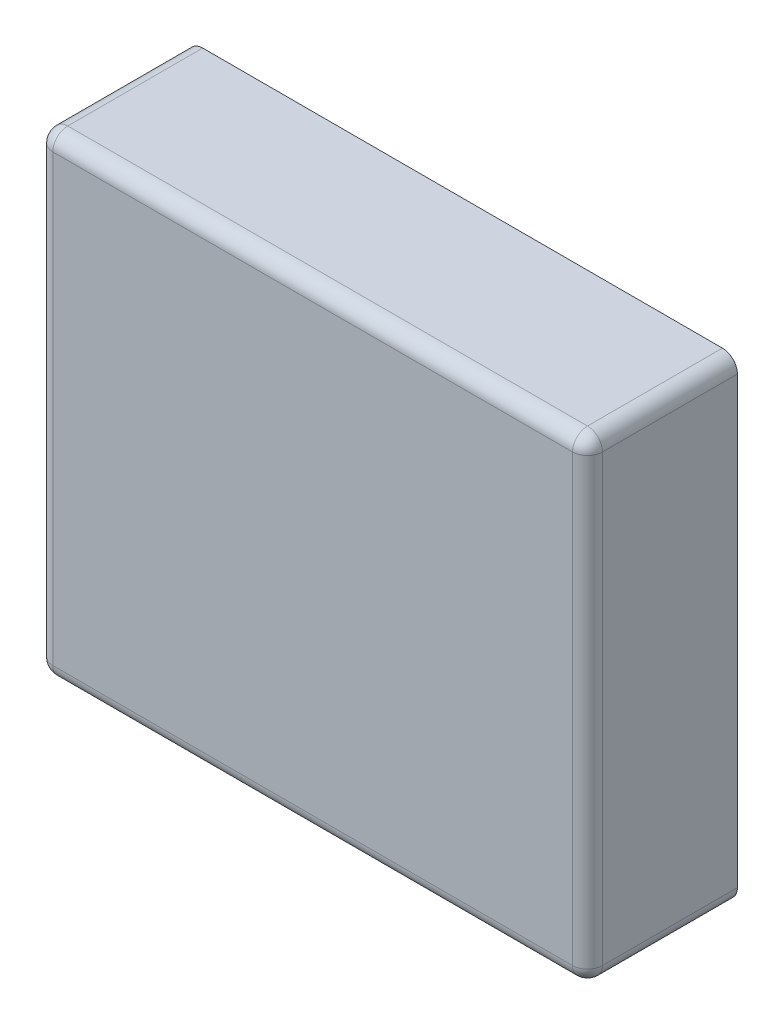
ISO-10303-21;
HEADER;
FILE_DESCRIPTION(('STEP AP214'),'2;1');
FILE_NAME('part.step','',(''),(''),'','','');
FILE_SCHEMA(('AUTOMOTIVE_DESIGN { 1 0 10303 214 1 1 1 1 }'));
ENDSEC;
DATA;
#1=APPLICATION_CONTEXT('core data for automotive mechanical design processes');
#2=APPLICATION_PROTOCOL_DEFINITION('international standard','automotive_design',2000,#1);
#3=PRODUCT_CONTEXT('',#1,'mechanical');
#4=PRODUCT('Part','Part','',(#3));
#5=PRODUCT_RELATED_PRODUCT_CATEGORY('part','',(#4));
#6=PRODUCT_DEFINITION_FORMATION('','',#4);
#7=PRODUCT_DEFINITION_CONTEXT('part definition',#1,'design');
#8=PRODUCT_DEFINITION('design','',#6,#7);
#9=PRODUCT_DEFINITION_SHAPE('','',#8);
#10=(LENGTH_UNIT() NAMED_UNIT(*) SI_UNIT(.MILLI.,.METRE.));
#11=(NAMED_UNIT(*) PLANE_ANGLE_UNIT() SI_UNIT($,.RADIAN.));
#12=(NAMED_UNIT(*) SI_UNIT($,.STERADIAN.) SOLID_ANGLE_UNIT());
#13=UNCERTAINTY_MEASURE_WITH_UNIT(LENGTH_MEASURE(1.E-05),#10,'distance_accuracy_value','');
#14=(GEOMETRIC_REPRESENTATION_CONTEXT(3) GLOBAL_UNCERTAINTY_ASSIGNED_CONTEXT((#13)) GLOBAL_UNIT_ASSIGNED_CONTEXT((#10,
#11,#12)) REPRESENTATION_CONTEXT('',''));
#15=CARTESIAN_POINT('',(0.,0.,0.));
#16=DIRECTION('',(0.,0.,1.));
#17=DIRECTION('',(1.,0.,0.));
#18=AXIS2_PLACEMENT_3D('',#15,#16,#17);
#19=CARTESIAN_POINT('',(0.,0.,0.));
#20=DIRECTION('',(0.,0.,1.));
#21=DIRECTION('',(1.,0.,0.));
#22=AXIS2_PLACEMENT_3D('',#19,#20,#21);
#23=PLANE('',#22);
#24=DIRECTION('',(1.,0.,0.));
#25=VECTOR('',#24,1.);
#26=CARTESIAN_POINT('',(-54.9941107184923,-64.4935217903416,0.));
#27=LINE('',#26,#25);
#28=CARTESIAN_POINT('',(-51.9941107184923,-64.4935217903416,0.));
#29=VERTEX_POINT('',#28);
#30=CARTESIAN_POINT('',(52.0058892815077,-64.4935217903416,0.));
#31=VERTEX_POINT('',#30);
#32=EDGE_CURVE('E253',#29,#31,#27,.T.);
#33=ORIENTED_EDGE('',*,*,#32,.F.);
#34=CARTESIAN_POINT('',(-51.9941107184923,-61.4935217903416,0.));
#35=DIRECTION('',(0.,0.,1.));
#36=DIRECTION('',(1.,0.,0.));
#37=AXIS2_PLACEMENT_3D('',#34,#35,#36);
#38=CIRCLE('',#37,3.);
#39=CARTESIAN_POINT('',(-54.9941107184923,-61.4935217903416,0.));
#40=VERTEX_POINT('',#39);
#41=EDGE_CURVE('E11',#29,#40,#38,.F.);
#42=ORIENTED_EDGE('',*,*,#41,.T.);
#43=DIRECTION('',(0.,-1.,0.));
#44=VECTOR('',#43,1.);
#45=CARTESIAN_POINT('',(-54.9941107184923,30.5064782096584,0.));
#46=LINE('',#45,#44);
#47=CARTESIAN_POINT('',(-54.9941107184923,27.5064782096584,0.));
#48=VERTEX_POINT('',#47);
#49=EDGE_CURVE('E250',#48,#40,#46,.T.);
#50=ORIENTED_EDGE('',*,*,#49,.F.);
#51=CARTESIAN_POINT('',(-51.9941107184923,27.5064782096584,0.));
#52=DIRECTION('',(0.,0.,1.));
#53=DIRECTION('',(1.,0.,0.));
#54=AXIS2_PLACEMENT_3D('',#51,#52,#53);
#55=CIRCLE('',#54,3.);
#56=CARTESIAN_POINT('',(-51.9941107184923,30.5064782096584,0.));
#57=VERTEX_POINT('',#56);
#58=EDGE_CURVE('E297',#48,#57,#55,.F.);
#59=ORIENTED_EDGE('',*,*,#58,.T.);
#60=DIRECTION('',(-1.,0.,0.));
#61=VECTOR('',#60,1.);
#62=CARTESIAN_POINT('',(-54.9941107184923,30.5064782096584,0.));
#63=LINE('',#62,#61);
#64=CARTESIAN_POINT('',(52.0058892815077,30.5064782096584,0.));
#65=VERTEX_POINT('',#64);
#66=EDGE_CURVE('E259',#65,#57,#63,.T.);
#67=ORIENTED_EDGE('',*,*,#66,.F.);
#68=CARTESIAN_POINT('',(52.0058892815077,27.5064782096584,0.));
#69=DIRECTION('',(0.,0.,1.));
#70=DIRECTION('',(1.,0.,0.));
#71=AXIS2_PLACEMENT_3D('',#68,#69,#70);
#72=CIRCLE('',#71,3.);
#73=CARTESIAN_POINT('',(55.0058892815077,27.5064782096584,0.));
#74=VERTEX_POINT('',#73);
#75=EDGE_CURVE('E295',#65,#74,#72,.F.);
#76=ORIENTED_EDGE('',*,*,#75,.T.);
#77=DIRECTION('',(0.,1.,0.));
#78=VECTOR('',#77,1.);
#79=CARTESIAN_POINT('',(55.0058892815077,30.5064782096584,0.));
#80=LINE('',#79,#78);
#81=CARTESIAN_POINT('',(55.0058892815077,-61.4935217903416,0.));
#82=VERTEX_POINT('',#81);
#83=EDGE_CURVE('E256',#82,#74,#80,.T.);
#84=ORIENTED_EDGE('',*,*,#83,.F.);
#85=CARTESIAN_POINT('',(52.0058892815077,-61.4935217903416,0.));
#86=DIRECTION('',(0.,0.,1.));
#87=DIRECTION('',(1.,0.,0.));
#88=AXIS2_PLACEMENT_3D('',#85,#86,#87);
#89=CIRCLE('',#88,3.);
#90=EDGE_CURVE('E45',#82,#31,#89,.F.);
#91=ORIENTED_EDGE('',*,*,#90,.T.);
#92=EDGE_LOOP('',(#33,#42,#50,#59,#67,#76,#84,#91));
#93=FACE_BOUND('',#92,.T.);
#94=CARTESIAN_POINT('',(-51.9941107184923,-61.4935217903416,0.));
#95=DIRECTION('',(0.,0.,1.));
#96=DIRECTION('',(1.,0.,0.));
#97=AXIS2_PLACEMENT_3D('',#94,#95,#96);
#98=CIRCLE('',#97,2.);
#99=CARTESIAN_POINT('',(-51.9941107184923,-63.4935217903416,0.));
#100=VERTEX_POINT('',#99);
#101=CARTESIAN_POINT('',(-53.9941107184923,-61.4935217903416,0.));
#102=VERTEX_POINT('',#101);
#103=EDGE_CURVE('E181',#100,#102,#98,.F.);
#104=ORIENTED_EDGE('',*,*,#103,.F.);
#105=DIRECTION('',(1.,0.,0.));
#106=VECTOR('',#105,1.);
#107=CARTESIAN_POINT('',(-54.9941107184923,-63.4935217903416,0.));
#108=LINE('',#107,#106);
#109=CARTESIAN_POINT('',(52.0058892815077,-63.4935217903416,0.));
#110=VERTEX_POINT('',#109);
#111=EDGE_CURVE('E234',#100,#110,#108,.T.);
#112=ORIENTED_EDGE('',*,*,#111,.T.);
#113=CARTESIAN_POINT('',(52.0058892815077,-61.4935217903416,0.));
#114=DIRECTION('',(0.,0.,1.));
#115=DIRECTION('',(1.,0.,0.));
#116=AXIS2_PLACEMENT_3D('',#113,#114,#115);
#117=CIRCLE('',#116,2.);
#118=CARTESIAN_POINT('',(54.0058892815077,-61.4935217903416,0.));
#119=VERTEX_POINT('',#118);
#120=EDGE_CURVE('E238',#119,#110,#117,.F.);
#121=ORIENTED_EDGE('',*,*,#120,.F.);
#122=DIRECTION('',(0.,1.,0.));
#123=VECTOR('',#122,1.);
#124=CARTESIAN_POINT('',(54.0058892815077,30.5064782096584,0.));
#125=LINE('',#124,#123);
#126=CARTESIAN_POINT('',(54.0058892815077,27.5064782096584,0.));
#127=VERTEX_POINT('',#126);
#128=EDGE_CURVE('E53',#119,#127,#125,.T.);
#129=ORIENTED_EDGE('',*,*,#128,.T.);
#130=CARTESIAN_POINT('',(52.0058892815077,27.5064782096584,0.));
#131=DIRECTION('',(0.,0.,1.));
#132=DIRECTION('',(1.,0.,0.));
#133=AXIS2_PLACEMENT_3D('',#130,#131,#132);
#134=CIRCLE('',#133,2.);
#135=CARTESIAN_POINT('',(52.0058892815077,29.5064782096584,0.));
#136=VERTEX_POINT('',#135);
#137=EDGE_CURVE('E225',#136,#127,#134,.F.);
#138=ORIENTED_EDGE('',*,*,#137,.F.);
#139=DIRECTION('',(-1.,0.,0.));
#140=VECTOR('',#139,1.);
#141=CARTESIAN_POINT('',(-54.9941107184923,29.5064782096584,0.));
#142=LINE('',#141,#140);
#143=CARTESIAN_POINT('',(-51.9941107184923,29.5064782096584,0.));
#144=VERTEX_POINT('',#143);
#145=EDGE_CURVE('E239',#136,#144,#142,.T.);
#146=ORIENTED_EDGE('',*,*,#145,.T.);
#147=CARTESIAN_POINT('',(-51.9941107184923,27.5064782096584,0.));
#148=DIRECTION('',(0.,0.,1.));
#149=DIRECTION('',(1.,0.,0.));
#150=AXIS2_PLACEMENT_3D('',#147,#148,#149);
#151=CIRCLE('',#150,2.);
#152=CARTESIAN_POINT('',(-53.9941107184923,27.5064782096584,0.));
#153=VERTEX_POINT('',#152);
#154=EDGE_CURVE('E236',#153,#144,#151,.F.);
#155=ORIENTED_EDGE('',*,*,#154,.F.);
#156=DIRECTION('',(0.,-1.,0.));
#157=VECTOR('',#156,1.);
#158=CARTESIAN_POINT('',(-53.9941107184923,30.5064782096584,0.));
#159=LINE('',#158,#157);
#160=EDGE_CURVE('E232',#153,#102,#159,.T.);
#161=ORIENTED_EDGE('',*,*,#160,.T.);
#162=EDGE_LOOP('',(#104,#112,#121,#129,#138,#146,#155,#161));
#163=FACE_BOUND('',#162,.T.);
#164=ADVANCED_FACE('F36',(#93,#163),#23,.F.);
#165=CARTESIAN_POINT('',(-54.9941107184923,30.5064782096584,30.));
#166=DIRECTION('',(1.,0.,0.));
#167=DIRECTION('',(0.,1.,0.));
#168=AXIS2_PLACEMENT_3D('',#165,#166,#167);
#169=PLANE('',#168);
#170=ORIENTED_EDGE('',*,*,#49,.T.);
#171=DIRECTION('',(0.,0.,-1.));
#172=VECTOR('',#171,1.);
#173=CARTESIAN_POINT('',(-54.9941107184923,-61.4935217903416,30.));
#174=LINE('',#173,#172);
#175=CARTESIAN_POINT('',(-54.9941107184923,-61.4935217903416,27.));
#176=VERTEX_POINT('',#175);
#177=EDGE_CURVE('E276',#40,#176,#174,.F.);
#178=ORIENTED_EDGE('',*,*,#177,.T.);
#179=DIRECTION('',(0.,-1.,0.));
#180=VECTOR('',#179,1.);
#181=CARTESIAN_POINT('',(-54.9941107184923,30.5064782096584,27.));
#182=LINE('',#181,#180);
#183=CARTESIAN_POINT('',(-54.9941107184923,27.5064782096584,27.));
#184=VERTEX_POINT('',#183);
#185=EDGE_CURVE('E273',#176,#184,#182,.F.);
#186=ORIENTED_EDGE('',*,*,#185,.T.);
#187=DIRECTION('',(0.,0.,-1.));
#188=VECTOR('',#187,1.);
#189=CARTESIAN_POINT('',(-54.9941107184923,27.5064782096584,30.));
#190=LINE('',#189,#188);
#191=EDGE_CURVE('E271',#184,#48,#190,.T.);
#192=ORIENTED_EDGE('',*,*,#191,.T.);
#193=EDGE_LOOP('',(#170,#178,#186,#192));
#194=FACE_BOUND('',#193,.T.);
#195=ADVANCED_FACE('F382',(#194),#169,.F.);
#196=CARTESIAN_POINT('',(-54.9941107184923,-64.4935217903416,30.));
#197=DIRECTION('',(0.,1.,0.));
#198=DIRECTION('',(0.,0.,1.));
#199=AXIS2_PLACEMENT_3D('',#196,#197,#198);
#200=PLANE('',#199);
#201=DIRECTION('',(1.,0.,0.));
#202=VECTOR('',#201,1.);
#203=CARTESIAN_POINT('',(-54.9941107184923,-64.4935217903416,27.));
#204=LINE('',#203,#202);
#205=CARTESIAN_POINT('',(52.0058892815077,-64.4935217903416,27.));
#206=VERTEX_POINT('',#205);
#207=CARTESIAN_POINT('',(-51.9941107184923,-64.4935217903416,27.));
#208=VERTEX_POINT('',#207);
#209=EDGE_CURVE('E61',#206,#208,#204,.F.);
#210=ORIENTED_EDGE('',*,*,#209,.T.);
#211=DIRECTION('',(0.,0.,-1.));
#212=VECTOR('',#211,1.);
#213=CARTESIAN_POINT('',(-51.9941107184923,-64.4935217903416,30.));
#214=LINE('',#213,#212);
#215=EDGE_CURVE('E293',#208,#29,#214,.T.);
#216=ORIENTED_EDGE('',*,*,#215,.T.);
#217=ORIENTED_EDGE('',*,*,#32,.T.);
#218=DIRECTION('',(0.,0.,-1.));
#219=VECTOR('',#218,1.);
#220=CARTESIAN_POINT('',(52.0058892815077,-64.4935217903416,30.));
#221=LINE('',#220,#219);
#222=EDGE_CURVE('E290',#31,#206,#221,.F.);
#223=ORIENTED_EDGE('',*,*,#222,.T.);
#224=EDGE_LOOP('',(#210,#216,#217,#223));
#225=FACE_BOUND('',#224,.T.);
#226=ADVANCED_FACE('F367',(#225),#200,.F.);
#227=CARTESIAN_POINT('',(55.0058892815077,30.5064782096584,30.));
#228=DIRECTION('',(-1.,0.,0.));
#229=DIRECTION('',(0.,-1.,0.));
#230=AXIS2_PLACEMENT_3D('',#227,#228,#229);
#231=PLANE('',#230);
#232=DIRECTION('',(0.,1.,0.));
#233=VECTOR('',#232,1.);
#234=CARTESIAN_POINT('',(55.0058892815077,-64.4935217903416,27.));
#235=LINE('',#234,#233);
#236=CARTESIAN_POINT('',(55.0058892815077,27.5064782096584,27.));
#237=VERTEX_POINT('',#236);
#238=CARTESIAN_POINT('',(55.0058892815077,-61.4935217903416,27.));
#239=VERTEX_POINT('',#238);
#240=EDGE_CURVE('E286',#237,#239,#235,.F.);
#241=ORIENTED_EDGE('',*,*,#240,.T.);
#242=DIRECTION('',(0.,0.,-1.));
#243=VECTOR('',#242,1.);
#244=CARTESIAN_POINT('',(55.0058892815077,-61.4935217903416,30.));
#245=LINE('',#244,#243);
#246=EDGE_CURVE('E288',#239,#82,#245,.T.);
#247=ORIENTED_EDGE('',*,*,#246,.T.);
#248=ORIENTED_EDGE('',*,*,#83,.T.);
#249=DIRECTION('',(0.,0.,-1.));
#250=VECTOR('',#249,1.);
#251=CARTESIAN_POINT('',(55.0058892815077,27.5064782096584,30.));
#252=LINE('',#251,#250);
#253=EDGE_CURVE('E284',#74,#237,#252,.F.);
#254=ORIENTED_EDGE('',*,*,#253,.T.);
#255=EDGE_LOOP('',(#241,#247,#248,#254));
#256=FACE_BOUND('',#255,.T.);
#257=ADVANCED_FACE('F355',(#256),#231,.F.);
#258=CARTESIAN_POINT('',(-54.9941107184923,30.5064782096584,30.));
#259=DIRECTION('',(0.,-1.,0.));
#260=DIRECTION('',(0.,0.,-1.));
#261=AXIS2_PLACEMENT_3D('',#258,#259,#260);
#262=PLANE('',#261);
#263=ORIENTED_EDGE('',*,*,#66,.T.);
#264=DIRECTION('',(0.,0.,-1.));
#265=VECTOR('',#264,1.);
#266=CARTESIAN_POINT('',(-51.9941107184923,30.5064782096584,30.));
#267=LINE('',#266,#265);
#268=CARTESIAN_POINT('',(-51.9941107184923,30.5064782096584,27.));
#269=VERTEX_POINT('',#268);
#270=EDGE_CURVE('E282',#57,#269,#267,.F.);
#271=ORIENTED_EDGE('',*,*,#270,.T.);
#272=DIRECTION('',(-1.,0.,0.));
#273=VECTOR('',#272,1.);
#274=CARTESIAN_POINT('',(55.0058892815077,30.5064782096584,27.));
#275=LINE('',#274,#273);
#276=CARTESIAN_POINT('',(52.0058892815077,30.5064782096584,27.));
#277=VERTEX_POINT('',#276);
#278=EDGE_CURVE('E280',#269,#277,#275,.F.);
#279=ORIENTED_EDGE('',*,*,#278,.T.);
#280=DIRECTION('',(0.,0.,-1.));
#281=VECTOR('',#280,1.);
#282=CARTESIAN_POINT('',(52.0058892815077,30.5064782096584,30.));
#283=LINE('',#282,#281);
#284=EDGE_CURVE('E278',#277,#65,#283,.T.);
#285=ORIENTED_EDGE('',*,*,#284,.T.);
#286=EDGE_LOOP('',(#263,#271,#279,#285));
#287=FACE_BOUND('',#286,.T.);
#288=ADVANCED_FACE('F391',(#287),#262,.F.);
#289=CARTESIAN_POINT('',(0.,0.,30.));
#290=DIRECTION('',(0.,0.,1.));
#291=DIRECTION('',(1.,0.,0.));
#292=AXIS2_PLACEMENT_3D('',#289,#290,#291);
#293=PLANE('',#292);
#294=DIRECTION('',(-1.,0.,0.));
#295=VECTOR('',#294,1.);
#296=CARTESIAN_POINT('',(-54.9941107184923,27.5064782096584,30.));
#297=LINE('',#296,#295);
#298=CARTESIAN_POINT('',(52.0058892815077,27.5064782096584,30.));
#299=VERTEX_POINT('',#298);
#300=CARTESIAN_POINT('',(-51.9941107184923,27.5064782096584,30.));
#301=VERTEX_POINT('',#300);
#302=EDGE_CURVE('E266',#299,#301,#297,.T.);
#303=ORIENTED_EDGE('',*,*,#302,.T.);
#304=DIRECTION('',(0.,-1.,0.));
#305=VECTOR('',#304,1.);
#306=CARTESIAN_POINT('',(-51.9941107184923,-64.4935217903416,30.));
#307=LINE('',#306,#305);
#308=CARTESIAN_POINT('',(-51.9941107184923,-61.4935217903416,30.));
#309=VERTEX_POINT('',#308);
#310=EDGE_CURVE('E268',#301,#309,#307,.T.);
#311=ORIENTED_EDGE('',*,*,#310,.T.);
#312=DIRECTION('',(1.,0.,0.));
#313=VECTOR('',#312,1.);
#314=CARTESIAN_POINT('',(55.0058892815077,-61.4935217903416,30.));
#315=LINE('',#314,#313);
#316=CARTESIAN_POINT('',(52.0058892815077,-61.4935217903416,30.));
#317=VERTEX_POINT('',#316);
#318=EDGE_CURVE('E262',#309,#317,#315,.T.);
#319=ORIENTED_EDGE('',*,*,#318,.T.);
#320=DIRECTION('',(0.,1.,0.));
#321=VECTOR('',#320,1.);
#322=CARTESIAN_POINT('',(52.0058892815077,30.5064782096584,30.));
#323=LINE('',#322,#321);
#324=EDGE_CURVE('E264',#317,#299,#323,.T.);
#325=ORIENTED_EDGE('',*,*,#324,.T.);
#326=EDGE_LOOP('',(#303,#311,#319,#325));
#327=FACE_BOUND('',#326,.T.);
#328=ADVANCED_FACE('F345',(#327),#293,.T.);
#329=CARTESIAN_POINT('',(52.0058892815077,27.5064782096584,30.));
#330=DIRECTION('',(0.,0.,-1.));
#331=DIRECTION('',(-1.,0.,0.));
#332=AXIS2_PLACEMENT_3D('',#329,#330,#331);
#333=CYLINDRICAL_SURFACE('',#332,3.);
#334=ORIENTED_EDGE('',*,*,#75,.F.);
#335=ORIENTED_EDGE('',*,*,#284,.F.);
#336=CARTESIAN_POINT('',(52.0058892815077,27.5064782096584,27.));
#337=DIRECTION('',(0.,0.,1.));
#338=DIRECTION('',(1.,0.,0.));
#339=AXIS2_PLACEMENT_3D('',#336,#337,#338);
#340=CIRCLE('',#339,3.);
#341=EDGE_CURVE('E40',#237,#277,#340,.T.);
#342=ORIENTED_EDGE('',*,*,#341,.F.);
#343=ORIENTED_EDGE('',*,*,#253,.F.);
#344=EDGE_LOOP('',(#334,#335,#342,#343));
#345=FACE_BOUND('',#344,.T.);
#346=ADVANCED_FACE('F38',(#345),#333,.T.);
#347=CARTESIAN_POINT('',(52.0058892815077,0.,27.));
#348=DIRECTION('',(0.,-1.,0.));
#349=DIRECTION('',(1.,0.,0.));
#350=AXIS2_PLACEMENT_3D('',#347,#348,#349);
#351=CYLINDRICAL_SURFACE('',#350,3.);
#352=CARTESIAN_POINT('',(52.0058892815077,-61.4935217903416,27.));
#353=DIRECTION('',(0.,-1.,0.));
#354=DIRECTION('',(0.,0.,-1.));
#355=AXIS2_PLACEMENT_3D('',#352,#353,#354);
#356=CIRCLE('',#355,3.);
#357=EDGE_CURVE('E324',#239,#317,#356,.T.);
#358=ORIENTED_EDGE('',*,*,#357,.F.);
#359=ORIENTED_EDGE('',*,*,#240,.F.);
#360=CARTESIAN_POINT('',(52.0058892815077,27.5064782096584,27.));
#361=DIRECTION('',(0.,1.,0.));
#362=DIRECTION('',(0.,0.,1.));
#363=AXIS2_PLACEMENT_3D('',#360,#361,#362);
#364=CIRCLE('',#363,3.);
#365=EDGE_CURVE('E326',#299,#237,#364,.T.);
#366=ORIENTED_EDGE('',*,*,#365,.F.);
#367=ORIENTED_EDGE('',*,*,#324,.F.);
#368=EDGE_LOOP('',(#358,#359,#366,#367));
#369=FACE_BOUND('',#368,.T.);
#370=ADVANCED_FACE('F352',(#369),#351,.T.);
#371=CARTESIAN_POINT('',(52.0058892815077,-61.4935217903416,30.));
#372=DIRECTION('',(0.,0.,-1.));
#373=DIRECTION('',(-1.,0.,0.));
#374=AXIS2_PLACEMENT_3D('',#371,#372,#373);
#375=CYLINDRICAL_SURFACE('',#374,3.);
#376=ORIENTED_EDGE('',*,*,#90,.F.);
#377=ORIENTED_EDGE('',*,*,#246,.F.);
#378=CARTESIAN_POINT('',(52.0058892815077,-61.4935217903416,27.));
#379=DIRECTION('',(0.,0.,1.));
#380=DIRECTION('',(1.,0.,0.));
#381=AXIS2_PLACEMENT_3D('',#378,#379,#380);
#382=CIRCLE('',#381,3.);
#383=EDGE_CURVE('E321',#206,#239,#382,.T.);
#384=ORIENTED_EDGE('',*,*,#383,.F.);
#385=ORIENTED_EDGE('',*,*,#222,.F.);
#386=EDGE_LOOP('',(#376,#377,#384,#385));
#387=FACE_BOUND('',#386,.T.);
#388=ADVANCED_FACE('F360',(#387),#375,.T.);
#389=CARTESIAN_POINT('',(52.0058892815077,27.5064782096584,27.));
#390=DIRECTION('',(1.,0.,0.));
#391=DIRECTION('',(0.,0.,-1.));
#392=AXIS2_PLACEMENT_3D('',#389,#390,#391);
#393=SPHERICAL_SURFACE('',#392,3.);
#394=ORIENTED_EDGE('',*,*,#365,.T.);
#395=ORIENTED_EDGE('',*,*,#341,.T.);
#396=CARTESIAN_POINT('',(52.0058892815077,27.5064782096584,27.));
#397=DIRECTION('',(1.,0.,0.));
#398=DIRECTION('',(0.,0.,-1.));
#399=AXIS2_PLACEMENT_3D('',#396,#397,#398);
#400=CIRCLE('',#399,3.);
#401=EDGE_CURVE('E318',#299,#277,#400,.F.);
#402=ORIENTED_EDGE('',*,*,#401,.F.);
#403=EDGE_LOOP('',(#394,#395,#402));
#404=FACE_BOUND('',#403,.T.);
#405=ADVANCED_FACE('F333',(#404),#393,.T.);
#406=CARTESIAN_POINT('',(52.0058892815077,-61.4935217903416,27.));
#407=DIRECTION('',(1.,0.,0.));
#408=DIRECTION('',(0.,1.,0.));
#409=AXIS2_PLACEMENT_3D('',#406,#407,#408);
#410=SPHERICAL_SURFACE('',#409,3.);
#411=ORIENTED_EDGE('',*,*,#383,.T.);
#412=ORIENTED_EDGE('',*,*,#357,.T.);
#413=CARTESIAN_POINT('',(52.0058892815077,-61.4935217903416,27.));
#414=DIRECTION('',(1.,0.,0.));
#415=DIRECTION('',(0.,0.,-1.));
#416=AXIS2_PLACEMENT_3D('',#413,#414,#415);
#417=CIRCLE('',#416,3.);
#418=EDGE_CURVE('E315',#206,#317,#417,.F.);
#419=ORIENTED_EDGE('',*,*,#418,.F.);
#420=EDGE_LOOP('',(#411,#412,#419));
#421=FACE_BOUND('',#420,.T.);
#422=ADVANCED_FACE('F431',(#421),#410,.T.);
#423=CARTESIAN_POINT('',(-51.9941107184923,27.5064782096584,30.));
#424=DIRECTION('',(0.,0.,-1.));
#425=DIRECTION('',(-1.,0.,0.));
#426=AXIS2_PLACEMENT_3D('',#423,#424,#425);
#427=CYLINDRICAL_SURFACE('',#426,3.);
#428=ORIENTED_EDGE('',*,*,#58,.F.);
#429=ORIENTED_EDGE('',*,*,#191,.F.);
#430=CARTESIAN_POINT('',(-51.9941107184923,27.5064782096584,27.));
#431=DIRECTION('',(0.,0.,1.));
#432=DIRECTION('',(1.,0.,0.));
#433=AXIS2_PLACEMENT_3D('',#430,#431,#432);
#434=CIRCLE('',#433,3.);
#435=EDGE_CURVE('E312',#269,#184,#434,.T.);
#436=ORIENTED_EDGE('',*,*,#435,.F.);
#437=ORIENTED_EDGE('',*,*,#270,.F.);
#438=EDGE_LOOP('',(#428,#429,#436,#437));
#439=FACE_BOUND('',#438,.T.);
#440=ADVANCED_FACE('F389',(#439),#427,.T.);
#441=CARTESIAN_POINT('',(0.,27.5064782096584,27.));
#442=DIRECTION('',(1.,0.,0.));
#443=DIRECTION('',(0.,0.,-1.));
#444=AXIS2_PLACEMENT_3D('',#441,#442,#443);
#445=CYLINDRICAL_SURFACE('',#444,3.);
#446=ORIENTED_EDGE('',*,*,#401,.T.);
#447=ORIENTED_EDGE('',*,*,#278,.F.);
#448=CARTESIAN_POINT('',(-51.9941107184923,27.5064782096584,27.));
#449=DIRECTION('',(-1.,0.,0.));
#450=DIRECTION('',(0.,0.,1.));
#451=AXIS2_PLACEMENT_3D('',#448,#449,#450);
#452=CIRCLE('',#451,3.);
#453=EDGE_CURVE('E309',#301,#269,#452,.T.);
#454=ORIENTED_EDGE('',*,*,#453,.F.);
#455=ORIENTED_EDGE('',*,*,#302,.F.);
#456=EDGE_LOOP('',(#446,#447,#454,#455));
#457=FACE_BOUND('',#456,.T.);
#458=ADVANCED_FACE('F340',(#457),#445,.T.);
#459=CARTESIAN_POINT('',(0.,-61.4935217903416,27.));
#460=DIRECTION('',(-1.,0.,0.));
#461=DIRECTION('',(0.,0.,1.));
#462=AXIS2_PLACEMENT_3D('',#459,#460,#461);
#463=CYLINDRICAL_SURFACE('',#462,3.);
#464=ORIENTED_EDGE('',*,*,#418,.T.);
#465=ORIENTED_EDGE('',*,*,#318,.F.);
#466=CARTESIAN_POINT('',(-51.9941107184923,-61.4935217903416,27.));
#467=DIRECTION('',(-1.,0.,0.));
#468=DIRECTION('',(0.,0.,1.));
#469=AXIS2_PLACEMENT_3D('',#466,#467,#468);
#470=CIRCLE('',#469,3.);
#471=EDGE_CURVE('E306',#208,#309,#470,.T.);
#472=ORIENTED_EDGE('',*,*,#471,.F.);
#473=ORIENTED_EDGE('',*,*,#209,.F.);
#474=EDGE_LOOP('',(#464,#465,#472,#473));
#475=FACE_BOUND('',#474,.T.);
#476=ADVANCED_FACE('F375',(#475),#463,.T.);
#477=CARTESIAN_POINT('',(-51.9941107184923,-61.4935217903416,30.));
#478=DIRECTION('',(0.,0.,-1.));
#479=DIRECTION('',(-1.,0.,0.));
#480=AXIS2_PLACEMENT_3D('',#477,#478,#479);
#481=CYLINDRICAL_SURFACE('',#480,3.);
#482=ORIENTED_EDGE('',*,*,#41,.F.);
#483=ORIENTED_EDGE('',*,*,#215,.F.);
#484=CARTESIAN_POINT('',(-51.9941107184923,-61.4935217903416,27.));
#485=DIRECTION('',(0.,0.,1.));
#486=DIRECTION('',(1.,0.,0.));
#487=AXIS2_PLACEMENT_3D('',#484,#485,#486);
#488=CIRCLE('',#487,3.);
#489=EDGE_CURVE('E303',#176,#208,#488,.T.);
#490=ORIENTED_EDGE('',*,*,#489,.F.);
#491=ORIENTED_EDGE('',*,*,#177,.F.);
#492=EDGE_LOOP('',(#482,#483,#490,#491));
#493=FACE_BOUND('',#492,.T.);
#494=ADVANCED_FACE('F371',(#493),#481,.T.);
#495=CARTESIAN_POINT('',(-51.9941107184923,27.5064782096584,27.));
#496=DIRECTION('',(0.,1.,0.));
#497=DIRECTION('',(0.,0.,1.));
#498=AXIS2_PLACEMENT_3D('',#495,#496,#497);
#499=SPHERICAL_SURFACE('',#498,3.);
#500=ORIENTED_EDGE('',*,*,#453,.T.);
#501=ORIENTED_EDGE('',*,*,#435,.T.);
#502=CARTESIAN_POINT('',(-51.9941107184923,27.5064782096584,27.));
#503=DIRECTION('',(0.,1.,0.));
#504=DIRECTION('',(0.,0.,1.));
#505=AXIS2_PLACEMENT_3D('',#502,#503,#504);
#506=CIRCLE('',#505,3.);
#507=EDGE_CURVE('E301',#301,#184,#506,.F.);
#508=ORIENTED_EDGE('',*,*,#507,.F.);
#509=EDGE_LOOP('',(#500,#501,#508));
#510=FACE_BOUND('',#509,.T.);
#511=ADVANCED_FACE('F419',(#510),#499,.T.);
#512=CARTESIAN_POINT('',(-51.9941107184923,-61.4935217903416,27.));
#513=DIRECTION('',(0.,-1.,0.));
#514=DIRECTION('',(0.,0.,-1.));
#515=AXIS2_PLACEMENT_3D('',#512,#513,#514);
#516=SPHERICAL_SURFACE('',#515,3.);
#517=ORIENTED_EDGE('',*,*,#489,.T.);
#518=ORIENTED_EDGE('',*,*,#471,.T.);
#519=CARTESIAN_POINT('',(-51.9941107184923,-61.4935217903416,27.));
#520=DIRECTION('',(0.,-1.,0.));
#521=DIRECTION('',(0.,0.,-1.));
#522=AXIS2_PLACEMENT_3D('',#519,#520,#521);
#523=CIRCLE('',#522,3.);
#524=EDGE_CURVE('E249',#176,#309,#523,.F.);
#525=ORIENTED_EDGE('',*,*,#524,.F.);
#526=EDGE_LOOP('',(#517,#518,#525));
#527=FACE_BOUND('',#526,.T.);
#528=ADVANCED_FACE('F378',(#527),#516,.T.);
#529=CARTESIAN_POINT('',(-51.9941107184923,0.,27.));
#530=DIRECTION('',(0.,1.,0.));
#531=DIRECTION('',(-1.,0.,0.));
#532=AXIS2_PLACEMENT_3D('',#529,#530,#531);
#533=CYLINDRICAL_SURFACE('',#532,3.);
#534=ORIENTED_EDGE('',*,*,#507,.T.);
#535=ORIENTED_EDGE('',*,*,#185,.F.);
#536=ORIENTED_EDGE('',*,*,#524,.T.);
#537=ORIENTED_EDGE('',*,*,#310,.F.);
#538=EDGE_LOOP('',(#534,#535,#536,#537));
#539=FACE_BOUND('',#538,.T.);
#540=ADVANCED_FACE('F380',(#539),#533,.T.);
#541=CARTESIAN_POINT('',(-53.9941107184923,30.5064782096584,30.));
#542=DIRECTION('',(1.,0.,0.));
#543=DIRECTION('',(0.,1.,0.));
#544=AXIS2_PLACEMENT_3D('',#541,#542,#543);
#545=PLANE('',#544);
#546=ORIENTED_EDGE('',*,*,#160,.F.);
#547=DIRECTION('',(0.,0.,1.));
#548=VECTOR('',#547,1.);
#549=CARTESIAN_POINT('',(-53.9941107184923,27.5064782096584,30.));
#550=LINE('',#549,#548);
#551=CARTESIAN_POINT('',(-53.9941107184923,27.5064782096584,27.));
#552=VERTEX_POINT('',#551);
#553=EDGE_CURVE('E201',#552,#153,#550,.F.);
#554=ORIENTED_EDGE('',*,*,#553,.F.);
#555=DIRECTION('',(0.,1.,0.));
#556=VECTOR('',#555,1.);
#557=CARTESIAN_POINT('',(-53.9941107184923,30.5064782096584,27.));
#558=LINE('',#557,#556);
#559=CARTESIAN_POINT('',(-53.9941107184923,-61.4935217903416,27.));
#560=VERTEX_POINT('',#559);
#561=EDGE_CURVE('E187',#560,#552,#558,.T.);
#562=ORIENTED_EDGE('',*,*,#561,.F.);
#563=DIRECTION('',(0.,0.,1.));
#564=VECTOR('',#563,1.);
#565=CARTESIAN_POINT('',(-53.9941107184923,-61.4935217903416,30.));
#566=LINE('',#565,#564);
#567=EDGE_CURVE('E176',#102,#560,#566,.T.);
#568=ORIENTED_EDGE('',*,*,#567,.F.);
#569=EDGE_LOOP('',(#546,#554,#562,#568));
#570=FACE_BOUND('',#569,.T.);
#571=ADVANCED_FACE('F200',(#570),#545,.T.);
#572=CARTESIAN_POINT('',(-54.9941107184923,-63.4935217903416,30.));
#573=DIRECTION('',(0.,1.,0.));
#574=DIRECTION('',(0.,0.,1.));
#575=AXIS2_PLACEMENT_3D('',#572,#573,#574);
#576=PLANE('',#575);
#577=DIRECTION('',(1.,0.,0.));
#578=VECTOR('',#577,1.);
#579=CARTESIAN_POINT('',(-54.9941107184923,-63.4935217903416,27.));
#580=LINE('',#579,#578);
#581=CARTESIAN_POINT('',(52.0058892815077,-63.4935217903416,27.));
#582=VERTEX_POINT('',#581);
#583=CARTESIAN_POINT('',(-51.9941107184923,-63.4935217903416,27.));
#584=VERTEX_POINT('',#583);
#585=EDGE_CURVE('E220',#582,#584,#580,.F.);
#586=ORIENTED_EDGE('',*,*,#585,.F.);
#587=DIRECTION('',(0.,0.,1.));
#588=VECTOR('',#587,1.);
#589=CARTESIAN_POINT('',(52.0058892815077,-63.4935217903416,30.));
#590=LINE('',#589,#588);
#591=EDGE_CURVE('E223',#110,#582,#590,.T.);
#592=ORIENTED_EDGE('',*,*,#591,.F.);
#593=ORIENTED_EDGE('',*,*,#111,.F.);
#594=DIRECTION('',(0.,0.,1.));
#595=VECTOR('',#594,1.);
#596=CARTESIAN_POINT('',(-51.9941107184923,-63.4935217903416,30.));
#597=LINE('',#596,#595);
#598=EDGE_CURVE('E222',#584,#100,#597,.F.);
#599=ORIENTED_EDGE('',*,*,#598,.F.);
#600=EDGE_LOOP('',(#586,#592,#593,#599));
#601=FACE_BOUND('',#600,.T.);
#602=ADVANCED_FACE('F489',(#601),#576,.T.);
#603=CARTESIAN_POINT('',(54.0058892815077,30.5064782096584,30.));
#604=DIRECTION('',(-1.,0.,0.));
#605=DIRECTION('',(0.,-1.,0.));
#606=AXIS2_PLACEMENT_3D('',#603,#604,#605);
#607=PLANE('',#606);
#608=DIRECTION('',(0.,-1.,0.));
#609=VECTOR('',#608,1.);
#610=CARTESIAN_POINT('',(54.0058892815077,30.5064782096584,27.));
#611=LINE('',#610,#609);
#612=CARTESIAN_POINT('',(54.0058892815077,27.5064782096584,27.));
#613=VERTEX_POINT('',#612);
#614=CARTESIAN_POINT('',(54.0058892815077,-61.4935217903416,27.));
#615=VERTEX_POINT('',#614);
#616=EDGE_CURVE('E714',#613,#615,#611,.T.);
#617=ORIENTED_EDGE('',*,*,#616,.F.);
#618=DIRECTION('',(0.,0.,1.));
#619=VECTOR('',#618,1.);
#620=CARTESIAN_POINT('',(54.0058892815077,27.5064782096584,30.));
#621=LINE('',#620,#619);
#622=EDGE_CURVE('E708',#127,#613,#621,.T.);
#623=ORIENTED_EDGE('',*,*,#622,.F.);
#624=ORIENTED_EDGE('',*,*,#128,.F.);
#625=DIRECTION('',(0.,0.,1.));
#626=VECTOR('',#625,1.);
#627=CARTESIAN_POINT('',(54.0058892815077,-61.4935217903416,30.));
#628=LINE('',#627,#626);
#629=EDGE_CURVE('E227',#615,#119,#628,.F.);
#630=ORIENTED_EDGE('',*,*,#629,.F.);
#631=EDGE_LOOP('',(#617,#623,#624,#630));
#632=FACE_BOUND('',#631,.T.);
#633=ADVANCED_FACE('F496',(#632),#607,.T.);
#634=CARTESIAN_POINT('',(-54.9941107184923,29.5064782096584,30.));
#635=DIRECTION('',(0.,-1.,0.));
#636=DIRECTION('',(0.,0.,-1.));
#637=AXIS2_PLACEMENT_3D('',#634,#635,#636);
#638=PLANE('',#637);
#639=ORIENTED_EDGE('',*,*,#145,.F.);
#640=DIRECTION('',(0.,0.,-1.));
#641=VECTOR('',#640,1.);
#642=CARTESIAN_POINT('',(52.0058892815077,29.5064782096584,30.));
#643=LINE('',#642,#641);
#644=CARTESIAN_POINT('',(52.0058892815077,29.5064782096584,27.));
#645=VERTEX_POINT('',#644);
#646=EDGE_CURVE('E186',#645,#136,#643,.T.);
#647=ORIENTED_EDGE('',*,*,#646,.F.);
#648=DIRECTION('',(1.,0.,0.));
#649=VECTOR('',#648,1.);
#650=CARTESIAN_POINT('',(-54.9941107184923,29.5064782096584,27.));
#651=LINE('',#650,#649);
#652=CARTESIAN_POINT('',(-51.9941107184923,29.5064782096584,27.));
#653=VERTEX_POINT('',#652);
#654=EDGE_CURVE('E700',#653,#645,#651,.T.);
#655=ORIENTED_EDGE('',*,*,#654,.F.);
#656=DIRECTION('',(0.,0.,-1.));
#657=VECTOR('',#656,1.);
#658=CARTESIAN_POINT('',(-51.9941107184923,29.5064782096584,30.));
#659=LINE('',#658,#657);
#660=EDGE_CURVE('E703',#144,#653,#659,.F.);
#661=ORIENTED_EDGE('',*,*,#660,.F.);
#662=EDGE_LOOP('',(#639,#647,#655,#661));
#663=FACE_BOUND('',#662,.T.);
#664=ADVANCED_FACE('F505',(#663),#638,.T.);
#665=CARTESIAN_POINT('',(0.,0.,29.));
#666=DIRECTION('',(0.,0.,1.));
#667=DIRECTION('',(1.,0.,0.));
#668=AXIS2_PLACEMENT_3D('',#665,#666,#667);
#669=PLANE('',#668);
#670=DIRECTION('',(1.,0.,0.));
#671=VECTOR('',#670,1.);
#672=CARTESIAN_POINT('',(0.,27.5064782096584,29.));
#673=LINE('',#672,#671);
#674=CARTESIAN_POINT('',(52.0058892815077,27.5064782096584,29.));
#675=VERTEX_POINT('',#674);
#676=CARTESIAN_POINT('',(-51.9941107184923,27.5064782096584,29.));
#677=VERTEX_POINT('',#676);
#678=EDGE_CURVE('E684',#675,#677,#673,.F.);
#679=ORIENTED_EDGE('',*,*,#678,.F.);
#680=DIRECTION('',(0.,1.,0.));
#681=VECTOR('',#680,1.);
#682=CARTESIAN_POINT('',(52.0058892815077,0.,29.));
#683=LINE('',#682,#681);
#684=CARTESIAN_POINT('',(52.0058892815077,-61.4935217903416,29.));
#685=VERTEX_POINT('',#684);
#686=EDGE_CURVE('E687',#685,#675,#683,.T.);
#687=ORIENTED_EDGE('',*,*,#686,.F.);
#688=DIRECTION('',(1.,0.,0.));
#689=VECTOR('',#688,1.);
#690=CARTESIAN_POINT('',(0.,-61.4935217903416,29.));
#691=LINE('',#690,#689);
#692=CARTESIAN_POINT('',(-51.9941107184923,-61.4935217903416,29.));
#693=VERTEX_POINT('',#692);
#694=EDGE_CURVE('E242',#693,#685,#691,.T.);
#695=ORIENTED_EDGE('',*,*,#694,.F.);
#696=DIRECTION('',(0.,1.,0.));
#697=VECTOR('',#696,1.);
#698=CARTESIAN_POINT('',(-51.9941107184923,0.,29.));
#699=LINE('',#698,#697);
#700=EDGE_CURVE('E208',#677,#693,#699,.F.);
#701=ORIENTED_EDGE('',*,*,#700,.F.);
#702=EDGE_LOOP('',(#679,#687,#695,#701));
#703=FACE_BOUND('',#702,.T.);
#704=ADVANCED_FACE('F513',(#703),#669,.F.);
#705=CARTESIAN_POINT('',(52.0058892815077,27.5064782096584,30.));
#706=DIRECTION('',(0.,0.,-1.));
#707=DIRECTION('',(-1.,0.,0.));
#708=AXIS2_PLACEMENT_3D('',#705,#706,#707);
#709=CYLINDRICAL_SURFACE('',#708,2.);
#710=ORIENTED_EDGE('',*,*,#137,.T.);
#711=ORIENTED_EDGE('',*,*,#622,.T.);
#712=CARTESIAN_POINT('',(52.0058892815077,27.5064782096584,27.));
#713=DIRECTION('',(0.,0.,-1.));
#714=DIRECTION('',(0.,1.,0.));
#715=AXIS2_PLACEMENT_3D('',#712,#713,#714);
#716=CIRCLE('',#715,2.);
#717=EDGE_CURVE('E235',#613,#645,#716,.F.);
#718=ORIENTED_EDGE('',*,*,#717,.T.);
#719=ORIENTED_EDGE('',*,*,#646,.T.);
#720=EDGE_LOOP('',(#710,#711,#718,#719));
#721=FACE_BOUND('',#720,.T.);
#722=ADVANCED_FACE('F522',(#721),#709,.F.);
#723=CARTESIAN_POINT('',(52.0058892815077,0.,27.));
#724=DIRECTION('',(0.,-1.,0.));
#725=DIRECTION('',(1.,0.,0.));
#726=AXIS2_PLACEMENT_3D('',#723,#724,#725);
#727=CYLINDRICAL_SURFACE('',#726,2.);
#728=CARTESIAN_POINT('',(52.0058892815077,-61.4935217903416,27.));
#729=DIRECTION('',(0.,1.,0.));
#730=DIRECTION('',(-1.,0.,0.));
#731=AXIS2_PLACEMENT_3D('',#728,#729,#730);
#732=CIRCLE('',#731,2.);
#733=EDGE_CURVE('E230',#615,#685,#732,.F.);
#734=ORIENTED_EDGE('',*,*,#733,.T.);
#735=ORIENTED_EDGE('',*,*,#686,.T.);
#736=CARTESIAN_POINT('',(52.0058892815077,27.5064782096584,27.));
#737=DIRECTION('',(0.,1.,0.));
#738=DIRECTION('',(0.,0.,1.));
#739=AXIS2_PLACEMENT_3D('',#736,#737,#738);
#740=CIRCLE('',#739,2.);
#741=EDGE_CURVE('E698',#675,#613,#740,.T.);
#742=ORIENTED_EDGE('',*,*,#741,.T.);
#743=ORIENTED_EDGE('',*,*,#616,.T.);
#744=EDGE_LOOP('',(#734,#735,#742,#743));
#745=FACE_BOUND('',#744,.T.);
#746=ADVANCED_FACE('F531',(#745),#727,.F.);
#747=CARTESIAN_POINT('',(52.0058892815077,-61.4935217903416,30.));
#748=DIRECTION('',(0.,0.,-1.));
#749=DIRECTION('',(-1.,0.,0.));
#750=AXIS2_PLACEMENT_3D('',#747,#748,#749);
#751=CYLINDRICAL_SURFACE('',#750,2.);
#752=ORIENTED_EDGE('',*,*,#120,.T.);
#753=ORIENTED_EDGE('',*,*,#591,.T.);
#754=CARTESIAN_POINT('',(52.0058892815077,-61.4935217903416,27.));
#755=DIRECTION('',(0.,0.,1.));
#756=DIRECTION('',(0.,-1.,0.));
#757=AXIS2_PLACEMENT_3D('',#754,#755,#756);
#758=CIRCLE('',#757,2.);
#759=EDGE_CURVE('E228',#582,#615,#758,.T.);
#760=ORIENTED_EDGE('',*,*,#759,.T.);
#761=ORIENTED_EDGE('',*,*,#629,.T.);
#762=EDGE_LOOP('',(#752,#753,#760,#761));
#763=FACE_BOUND('',#762,.T.);
#764=ADVANCED_FACE('F540',(#763),#751,.F.);
#765=CARTESIAN_POINT('',(52.0058892815077,27.5064782096584,27.));
#766=DIRECTION('',(1.,0.,0.));
#767=DIRECTION('',(0.,0.,-1.));
#768=AXIS2_PLACEMENT_3D('',#765,#766,#767);
#769=SPHERICAL_SURFACE('',#768,2.);
#770=ORIENTED_EDGE('',*,*,#741,.F.);
#771=CARTESIAN_POINT('',(52.0058892815077,27.5064782096584,27.));
#772=DIRECTION('',(1.,0.,0.));
#773=DIRECTION('',(0.,0.,-1.));
#774=AXIS2_PLACEMENT_3D('',#771,#772,#773);
#775=CIRCLE('',#774,2.);
#776=EDGE_CURVE('E216',#675,#645,#775,.F.);
#777=ORIENTED_EDGE('',*,*,#776,.T.);
#778=ORIENTED_EDGE('',*,*,#717,.F.);
#779=EDGE_LOOP('',(#770,#777,#778));
#780=FACE_BOUND('',#779,.T.);
#781=ADVANCED_FACE('F549',(#780),#769,.F.);
#782=CARTESIAN_POINT('',(52.0058892815077,-61.4935217903416,27.));
#783=DIRECTION('',(1.,0.,0.));
#784=DIRECTION('',(0.,1.,0.));
#785=AXIS2_PLACEMENT_3D('',#782,#783,#784);
#786=SPHERICAL_SURFACE('',#785,2.);
#787=ORIENTED_EDGE('',*,*,#759,.F.);
#788=CARTESIAN_POINT('',(52.0058892815077,-61.4935217903416,27.));
#789=DIRECTION('',(-1.,0.,0.));
#790=DIRECTION('',(0.,0.,1.));
#791=AXIS2_PLACEMENT_3D('',#788,#789,#790);
#792=CIRCLE('',#791,2.);
#793=EDGE_CURVE('E213',#582,#685,#792,.T.);
#794=ORIENTED_EDGE('',*,*,#793,.T.);
#795=ORIENTED_EDGE('',*,*,#733,.F.);
#796=EDGE_LOOP('',(#787,#794,#795));
#797=FACE_BOUND('',#796,.T.);
#798=ADVANCED_FACE('F558',(#797),#786,.F.);
#799=CARTESIAN_POINT('',(-51.9941107184923,27.5064782096584,30.));
#800=DIRECTION('',(0.,0.,-1.));
#801=DIRECTION('',(-1.,0.,0.));
#802=AXIS2_PLACEMENT_3D('',#799,#800,#801);
#803=CYLINDRICAL_SURFACE('',#802,2.);
#804=ORIENTED_EDGE('',*,*,#154,.T.);
#805=ORIENTED_EDGE('',*,*,#660,.T.);
#806=CARTESIAN_POINT('',(-51.9941107184923,27.5064782096584,27.));
#807=DIRECTION('',(0.,0.,-1.));
#808=DIRECTION('',(-1.,0.,0.));
#809=AXIS2_PLACEMENT_3D('',#806,#807,#808);
#810=CIRCLE('',#809,2.);
#811=EDGE_CURVE('E217',#653,#552,#810,.F.);
#812=ORIENTED_EDGE('',*,*,#811,.T.);
#813=ORIENTED_EDGE('',*,*,#553,.T.);
#814=EDGE_LOOP('',(#804,#805,#812,#813));
#815=FACE_BOUND('',#814,.T.);
#816=ADVANCED_FACE('F567',(#815),#803,.F.);
#817=CARTESIAN_POINT('',(0.,27.5064782096584,27.));
#818=DIRECTION('',(1.,0.,0.));
#819=DIRECTION('',(0.,0.,-1.));
#820=AXIS2_PLACEMENT_3D('',#817,#818,#819);
#821=CYLINDRICAL_SURFACE('',#820,2.);
#822=ORIENTED_EDGE('',*,*,#776,.F.);
#823=ORIENTED_EDGE('',*,*,#678,.T.);
#824=CARTESIAN_POINT('',(-51.9941107184923,27.5064782096584,27.));
#825=DIRECTION('',(-1.,0.,0.));
#826=DIRECTION('',(0.,0.,1.));
#827=AXIS2_PLACEMENT_3D('',#824,#825,#826);
#828=CIRCLE('',#827,2.);
#829=EDGE_CURVE('E219',#677,#653,#828,.T.);
#830=ORIENTED_EDGE('',*,*,#829,.T.);
#831=ORIENTED_EDGE('',*,*,#654,.T.);
#832=EDGE_LOOP('',(#822,#823,#830,#831));
#833=FACE_BOUND('',#832,.T.);
#834=ADVANCED_FACE('F576',(#833),#821,.F.);
#835=CARTESIAN_POINT('',(0.,-61.4935217903416,27.));
#836=DIRECTION('',(-1.,0.,0.));
#837=DIRECTION('',(0.,0.,1.));
#838=AXIS2_PLACEMENT_3D('',#835,#836,#837);
#839=CYLINDRICAL_SURFACE('',#838,2.);
#840=ORIENTED_EDGE('',*,*,#793,.F.);
#841=ORIENTED_EDGE('',*,*,#585,.T.);
#842=CARTESIAN_POINT('',(-51.9941107184923,-61.4935217903416,27.));
#843=DIRECTION('',(1.,0.,0.));
#844=DIRECTION('',(0.,0.,-1.));
#845=AXIS2_PLACEMENT_3D('',#842,#843,#844);
#846=CIRCLE('',#845,2.);
#847=EDGE_CURVE('E195',#584,#693,#846,.F.);
#848=ORIENTED_EDGE('',*,*,#847,.T.);
#849=ORIENTED_EDGE('',*,*,#694,.T.);
#850=EDGE_LOOP('',(#840,#841,#848,#849));
#851=FACE_BOUND('',#850,.T.);
#852=ADVANCED_FACE('F585',(#851),#839,.F.);
#853=CARTESIAN_POINT('',(-51.9941107184923,-61.4935217903416,30.));
#854=DIRECTION('',(0.,0.,-1.));
#855=DIRECTION('',(-1.,0.,0.));
#856=AXIS2_PLACEMENT_3D('',#853,#854,#855);
#857=CYLINDRICAL_SURFACE('',#856,2.);
#858=ORIENTED_EDGE('',*,*,#103,.T.);
#859=ORIENTED_EDGE('',*,*,#567,.T.);
#860=CARTESIAN_POINT('',(-51.9941107184923,-61.4935217903416,27.));
#861=DIRECTION('',(0.,0.,1.));
#862=DIRECTION('',(1.,0.,0.));
#863=AXIS2_PLACEMENT_3D('',#860,#861,#862);
#864=CIRCLE('',#863,2.);
#865=EDGE_CURVE('E179',#560,#584,#864,.T.);
#866=ORIENTED_EDGE('',*,*,#865,.T.);
#867=ORIENTED_EDGE('',*,*,#598,.T.);
#868=EDGE_LOOP('',(#858,#859,#866,#867));
#869=FACE_BOUND('',#868,.T.);
#870=ADVANCED_FACE('F178',(#869),#857,.F.);
#871=CARTESIAN_POINT('',(-51.9941107184923,27.5064782096584,27.));
#872=DIRECTION('',(0.,1.,0.));
#873=DIRECTION('',(0.,0.,1.));
#874=AXIS2_PLACEMENT_3D('',#871,#872,#873);
#875=SPHERICAL_SURFACE('',#874,2.);
#876=ORIENTED_EDGE('',*,*,#829,.F.);
#877=CARTESIAN_POINT('',(-51.9941107184923,27.5064782096584,27.));
#878=DIRECTION('',(0.,1.,0.));
#879=DIRECTION('',(-1.,0.,0.));
#880=AXIS2_PLACEMENT_3D('',#877,#878,#879);
#881=CIRCLE('',#880,2.);
#882=EDGE_CURVE('E196',#677,#552,#881,.F.);
#883=ORIENTED_EDGE('',*,*,#882,.T.);
#884=ORIENTED_EDGE('',*,*,#811,.F.);
#885=EDGE_LOOP('',(#876,#883,#884));
#886=FACE_BOUND('',#885,.T.);
#887=ADVANCED_FACE('F602',(#886),#875,.F.);
#888=CARTESIAN_POINT('',(-51.9941107184923,-61.4935217903416,27.));
#889=DIRECTION('',(0.,-1.,0.));
#890=DIRECTION('',(0.,0.,-1.));
#891=AXIS2_PLACEMENT_3D('',#888,#889,#890);
#892=SPHERICAL_SURFACE('',#891,2.);
#893=ORIENTED_EDGE('',*,*,#865,.F.);
#894=CARTESIAN_POINT('',(-51.9941107184923,-61.4935217903416,27.));
#895=DIRECTION('',(0.,1.,0.));
#896=DIRECTION('',(-1.,0.,0.));
#897=AXIS2_PLACEMENT_3D('',#894,#895,#896);
#898=CIRCLE('',#897,2.);
#899=EDGE_CURVE('E193',#560,#693,#898,.T.);
#900=ORIENTED_EDGE('',*,*,#899,.T.);
#901=ORIENTED_EDGE('',*,*,#847,.F.);
#902=EDGE_LOOP('',(#893,#900,#901));
#903=FACE_BOUND('',#902,.T.);
#904=ADVANCED_FACE('F191',(#903),#892,.F.);
#905=CARTESIAN_POINT('',(-51.9941107184923,0.,27.));
#906=DIRECTION('',(0.,1.,0.));
#907=DIRECTION('',(-1.,0.,0.));
#908=AXIS2_PLACEMENT_3D('',#905,#906,#907);
#909=CYLINDRICAL_SURFACE('',#908,2.);
#910=ORIENTED_EDGE('',*,*,#882,.F.);
#911=ORIENTED_EDGE('',*,*,#700,.T.);
#912=ORIENTED_EDGE('',*,*,#899,.F.);
#913=ORIENTED_EDGE('',*,*,#561,.T.);
#914=EDGE_LOOP('',(#910,#911,#912,#913));
#915=FACE_BOUND('',#914,.T.);
#916=ADVANCED_FACE('F206',(#915),#909,.F.);
#917=CLOSED_SHELL('',(#164,#195,#226,#257,#288,#328,#346,#370,#388,#405,#422,#440,#458,#476,
#494,#511,#528,#540,#571,#602,#633,#664,#704,#722,#746,#764,#781,#798,#816,#834,#852,#870,#887,
#904,#916));
#918=MANIFOLD_SOLID_BREP('B2',#917);
#919=ADVANCED_BREP_SHAPE_REPRESENTATION('',(#18,#918),#14);
#920=SHAPE_DEFINITION_REPRESENTATION(#9,#919);
ENDSEC;
END-ISO-10303-21;
